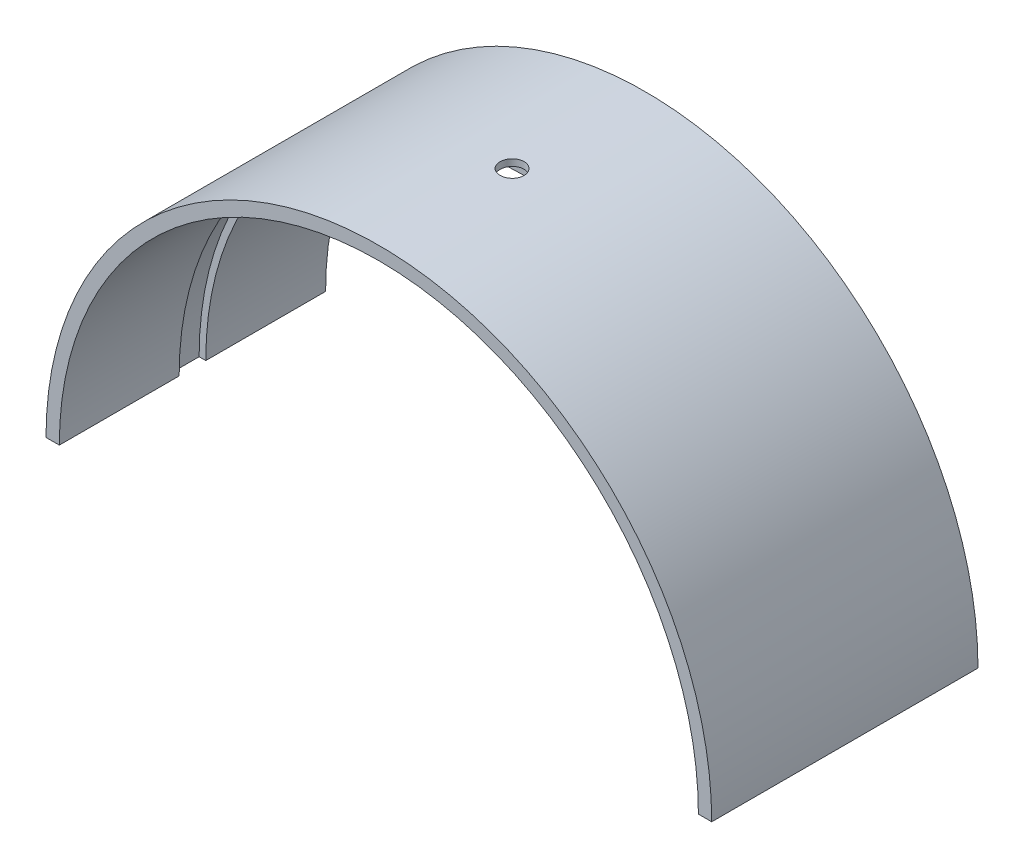
ISO-10303-21;
HEADER;
FILE_DESCRIPTION(('STEP AP214'),'2;1');
FILE_NAME('part.step','',(''),(''),'','','');
FILE_SCHEMA(('AUTOMOTIVE_DESIGN { 1 0 10303 214 1 1 1 1 }'));
ENDSEC;
DATA;
#1=APPLICATION_CONTEXT('core data for automotive mechanical design processes');
#2=APPLICATION_PROTOCOL_DEFINITION('international standard','automotive_design',2000,#1);
#3=PRODUCT_CONTEXT('',#1,'mechanical');
#4=PRODUCT('Part','Part','',(#3));
#5=PRODUCT_RELATED_PRODUCT_CATEGORY('part','',(#4));
#6=PRODUCT_DEFINITION_FORMATION('','',#4);
#7=PRODUCT_DEFINITION_CONTEXT('part definition',#1,'design');
#8=PRODUCT_DEFINITION('design','',#6,#7);
#9=PRODUCT_DEFINITION_SHAPE('','',#8);
#10=(LENGTH_UNIT() NAMED_UNIT(*) SI_UNIT(.MILLI.,.METRE.));
#11=(NAMED_UNIT(*) PLANE_ANGLE_UNIT() SI_UNIT($,.RADIAN.));
#12=(NAMED_UNIT(*) SI_UNIT($,.STERADIAN.) SOLID_ANGLE_UNIT());
#13=UNCERTAINTY_MEASURE_WITH_UNIT(LENGTH_MEASURE(1.E-05),#10,'distance_accuracy_value','');
#14=(GEOMETRIC_REPRESENTATION_CONTEXT(3) GLOBAL_UNCERTAINTY_ASSIGNED_CONTEXT((#13)) GLOBAL_UNIT_ASSIGNED_CONTEXT((#10,
#11,#12)) REPRESENTATION_CONTEXT('',''));
#15=CARTESIAN_POINT('',(0.,0.,0.));
#16=DIRECTION('',(0.,0.,1.));
#17=DIRECTION('',(1.,0.,0.));
#18=AXIS2_PLACEMENT_3D('',#15,#16,#17);
#19=CARTESIAN_POINT('',(0.,0.,20.));
#20=DIRECTION('',(0.,0.,-1.));
#21=DIRECTION('',(-1.,0.,0.));
#22=AXIS2_PLACEMENT_3D('',#19,#20,#21);
#23=CYLINDRICAL_SURFACE('',#22,24.);
#24=CARTESIAN_POINT('',(0.,0.,11.));
#25=DIRECTION('',(0.,0.,-1.));
#26=DIRECTION('',(-1.,0.,0.));
#27=AXIS2_PLACEMENT_3D('',#24,#25,#26);
#28=CIRCLE('',#27,24.);
#29=CARTESIAN_POINT('',(-24.,0.,11.));
#30=VERTEX_POINT('',#29);
#31=CARTESIAN_POINT('',(24.,0.,11.));
#32=VERTEX_POINT('',#31);
#33=EDGE_CURVE('E156',#30,#32,#28,.T.);
#34=ORIENTED_EDGE('',*,*,#33,.T.);
#35=DIRECTION('',(0.,0.,-1.));
#36=VECTOR('',#35,1.);
#37=CARTESIAN_POINT('',(24.,0.,20.));
#38=LINE('',#37,#36);
#39=CARTESIAN_POINT('',(24.,0.,20.));
#40=VERTEX_POINT('',#39);
#41=EDGE_CURVE('E118',#40,#32,#38,.T.);
#42=ORIENTED_EDGE('',*,*,#41,.F.);
#43=CARTESIAN_POINT('',(0.,0.,20.));
#44=DIRECTION('',(0.,0.,-1.));
#45=DIRECTION('',(1.,0.,0.));
#46=AXIS2_PLACEMENT_3D('',#43,#44,#45);
#47=CIRCLE('',#46,24.);
#48=CARTESIAN_POINT('',(-24.,0.,20.));
#49=VERTEX_POINT('',#48);
#50=EDGE_CURVE('E157',#49,#40,#47,.T.);
#51=ORIENTED_EDGE('',*,*,#50,.F.);
#52=DIRECTION('',(0.,0.,-1.));
#53=VECTOR('',#52,1.);
#54=CARTESIAN_POINT('',(-24.,0.,20.));
#55=LINE('',#54,#53);
#56=EDGE_CURVE('E131',#49,#30,#55,.T.);
#57=ORIENTED_EDGE('',*,*,#56,.T.);
#58=EDGE_LOOP('',(#34,#42,#51,#57));
#59=FACE_BOUND('',#58,.T.);
#60=ADVANCED_FACE('F34',(#59),#23,.F.);
#61=CARTESIAN_POINT('',(0.,0.,9.));
#62=DIRECTION('',(0.,0.,-1.));
#63=DIRECTION('',(-1.,0.,0.));
#64=AXIS2_PLACEMENT_3D('',#61,#62,#63);
#65=CIRCLE('',#64,24.);
#66=CARTESIAN_POINT('',(-24.,0.,9.));
#67=VERTEX_POINT('',#66);
#68=CARTESIAN_POINT('',(24.,0.,9.));
#69=VERTEX_POINT('',#68);
#70=EDGE_CURVE('E114',#67,#69,#65,.T.);
#71=ORIENTED_EDGE('',*,*,#70,.F.);
#72=CARTESIAN_POINT('',(-24.,0.,0.));
#73=VERTEX_POINT('',#72);
#74=EDGE_CURVE('E85',#67,#73,#55,.T.);
#75=ORIENTED_EDGE('',*,*,#74,.T.);
#76=CARTESIAN_POINT('',(0.,0.,0.));
#77=DIRECTION('',(0.,0.,-1.));
#78=DIRECTION('',(1.,0.,0.));
#79=AXIS2_PLACEMENT_3D('',#76,#77,#78);
#80=CIRCLE('',#79,24.);
#81=CARTESIAN_POINT('',(24.,0.,0.));
#82=VERTEX_POINT('',#81);
#83=EDGE_CURVE('E166',#73,#82,#80,.T.);
#84=ORIENTED_EDGE('',*,*,#83,.T.);
#85=EDGE_CURVE('E122',#69,#82,#38,.T.);
#86=ORIENTED_EDGE('',*,*,#85,.F.);
#87=EDGE_LOOP('',(#71,#75,#84,#86));
#88=FACE_BOUND('',#87,.T.);
#89=ADVANCED_FACE('F121',(#88),#23,.F.);
#90=CARTESIAN_POINT('',(25.,0.,20.));
#91=DIRECTION('',(0.,1.,0.));
#92=DIRECTION('',(0.,0.,1.));
#93=AXIS2_PLACEMENT_3D('',#90,#91,#92);
#94=PLANE('',#93);
#95=DIRECTION('',(-1.,0.,0.));
#96=VECTOR('',#95,1.);
#97=CARTESIAN_POINT('',(25.,0.,11.));
#98=LINE('',#97,#96);
#99=CARTESIAN_POINT('',(24.5,0.,11.));
#100=VERTEX_POINT('',#99);
#101=EDGE_CURVE('E162',#100,#32,#98,.T.);
#102=ORIENTED_EDGE('',*,*,#101,.F.);
#103=DIRECTION('',(0.,0.,-1.));
#104=VECTOR('',#103,1.);
#105=CARTESIAN_POINT('',(24.5,0.,0.));
#106=LINE('',#105,#104);
#107=CARTESIAN_POINT('',(24.5,0.,9.));
#108=VERTEX_POINT('',#107);
#109=EDGE_CURVE('E180',#108,#100,#106,.F.);
#110=ORIENTED_EDGE('',*,*,#109,.F.);
#111=DIRECTION('',(1.,0.,0.));
#112=VECTOR('',#111,1.);
#113=CARTESIAN_POINT('',(25.,0.,9.));
#114=LINE('',#113,#112);
#115=EDGE_CURVE('E179',#69,#108,#114,.T.);
#116=ORIENTED_EDGE('',*,*,#115,.F.);
#117=ORIENTED_EDGE('',*,*,#85,.T.);
#118=DIRECTION('',(1.,0.,0.));
#119=VECTOR('',#118,1.);
#120=CARTESIAN_POINT('',(25.,0.,0.));
#121=LINE('',#120,#119);
#122=CARTESIAN_POINT('',(25.,0.,0.));
#123=VERTEX_POINT('',#122);
#124=EDGE_CURVE('E168',#82,#123,#121,.T.);
#125=ORIENTED_EDGE('',*,*,#124,.T.);
#126=DIRECTION('',(0.,0.,-1.));
#127=VECTOR('',#126,1.);
#128=CARTESIAN_POINT('',(25.,0.,20.));
#129=LINE('',#128,#127);
#130=CARTESIAN_POINT('',(25.,0.,20.));
#131=VERTEX_POINT('',#130);
#132=EDGE_CURVE('E141',#131,#123,#129,.T.);
#133=ORIENTED_EDGE('',*,*,#132,.F.);
#134=DIRECTION('',(1.,0.,0.));
#135=VECTOR('',#134,1.);
#136=CARTESIAN_POINT('',(25.,0.,20.));
#137=LINE('',#136,#135);
#138=EDGE_CURVE('E93',#40,#131,#137,.T.);
#139=ORIENTED_EDGE('',*,*,#138,.F.);
#140=ORIENTED_EDGE('',*,*,#41,.T.);
#141=EDGE_LOOP('',(#102,#110,#116,#117,#125,#133,#139,#140));
#142=FACE_BOUND('',#141,.T.);
#143=ADVANCED_FACE('F178',(#142),#94,.F.);
#144=CARTESIAN_POINT('',(-24.,0.,20.));
#145=DIRECTION('',(0.,1.,0.));
#146=DIRECTION('',(0.,0.,1.));
#147=AXIS2_PLACEMENT_3D('',#144,#145,#146);
#148=PLANE('',#147);
#149=DIRECTION('',(-1.,0.,0.));
#150=VECTOR('',#149,1.);
#151=CARTESIAN_POINT('',(-24.,0.,11.));
#152=LINE('',#151,#150);
#153=CARTESIAN_POINT('',(-24.5,0.,11.));
#154=VERTEX_POINT('',#153);
#155=EDGE_CURVE('E11',#30,#154,#152,.T.);
#156=ORIENTED_EDGE('',*,*,#155,.F.);
#157=ORIENTED_EDGE('',*,*,#56,.F.);
#158=DIRECTION('',(1.,0.,0.));
#159=VECTOR('',#158,1.);
#160=CARTESIAN_POINT('',(-24.,0.,20.));
#161=LINE('',#160,#159);
#162=CARTESIAN_POINT('',(-25.,0.,20.));
#163=VERTEX_POINT('',#162);
#164=EDGE_CURVE('E63',#163,#49,#161,.T.);
#165=ORIENTED_EDGE('',*,*,#164,.F.);
#166=DIRECTION('',(0.,0.,-1.));
#167=VECTOR('',#166,1.);
#168=CARTESIAN_POINT('',(-25.,0.,20.));
#169=LINE('',#168,#167);
#170=CARTESIAN_POINT('',(-25.,0.,0.));
#171=VERTEX_POINT('',#170);
#172=EDGE_CURVE('E134',#163,#171,#169,.T.);
#173=ORIENTED_EDGE('',*,*,#172,.T.);
#174=DIRECTION('',(1.,0.,0.));
#175=VECTOR('',#174,1.);
#176=CARTESIAN_POINT('',(-24.,0.,0.));
#177=LINE('',#176,#175);
#178=EDGE_CURVE('E129',#171,#73,#177,.T.);
#179=ORIENTED_EDGE('',*,*,#178,.T.);
#180=ORIENTED_EDGE('',*,*,#74,.F.);
#181=DIRECTION('',(1.,0.,0.));
#182=VECTOR('',#181,1.);
#183=CARTESIAN_POINT('',(-24.,0.,9.));
#184=LINE('',#183,#182);
#185=CARTESIAN_POINT('',(-24.5,0.,9.));
#186=VERTEX_POINT('',#185);
#187=EDGE_CURVE('E112',#186,#67,#184,.T.);
#188=ORIENTED_EDGE('',*,*,#187,.F.);
#189=DIRECTION('',(0.,0.,-1.));
#190=VECTOR('',#189,1.);
#191=CARTESIAN_POINT('',(-24.5,0.,0.));
#192=LINE('',#191,#190);
#193=EDGE_CURVE('E47',#154,#186,#192,.T.);
#194=ORIENTED_EDGE('',*,*,#193,.F.);
#195=EDGE_LOOP('',(#156,#157,#165,#173,#179,#180,#188,#194));
#196=FACE_BOUND('',#195,.T.);
#197=ADVANCED_FACE('F126',(#196),#148,.F.);
#198=CARTESIAN_POINT('',(0.,0.,20.));
#199=DIRECTION('',(0.,0.,-1.));
#200=DIRECTION('',(-1.,0.,0.));
#201=AXIS2_PLACEMENT_3D('',#198,#199,#200);
#202=CYLINDRICAL_SURFACE('',#201,25.);
#203=CARTESIAN_POINT('',(0.,25.,9.1));
#204=CARTESIAN_POINT('',(0.050535829957511,24.9999997821146,9.10000223564241));
#205=CARTESIAN_POINT('',(0.101107886204852,24.9998451246391,9.10427073954814));
#206=CARTESIAN_POINT('',(0.200858013351447,24.9992430331769,9.12123874042541));
#207=CARTESIAN_POINT('',(0.250034351978574,24.998795250655,9.13394827432343));
#208=CARTESIAN_POINT('',(0.345533557905941,24.9976576121728,9.16743497476834));
#209=CARTESIAN_POINT('',(0.391857822470569,24.996967875876,9.18820815381038));
#210=CARTESIAN_POINT('',(0.480348825067872,24.9954241009306,9.23722664781565));
#211=CARTESIAN_POINT('',(0.522516566319997,24.9945701020761,9.26547015364747));
#212=CARTESIAN_POINT('',(0.601535420471143,24.992793372449,9.3286468030275));
#213=CARTESIAN_POINT('',(0.638383816447171,24.9918706069153,9.36358334407803));
#214=CARTESIAN_POINT('',(0.705695009782055,24.9900606494127,9.43914805243734));
#215=CARTESIAN_POINT('',(0.736157551232679,24.9891734588706,9.47977644773403));
#216=CARTESIAN_POINT('',(0.789837938182272,24.9875344936121,9.5655834282216));
#217=CARTESIAN_POINT('',(0.813053945584977,24.9867827532734,9.61076316403034));
#218=CARTESIAN_POINT('',(0.851570367321573,24.9854998231692,9.70438218213384));
#219=CARTESIAN_POINT('',(0.866870820397095,24.9849686323244,9.75282144847396));
#220=CARTESIAN_POINT('',(0.889115403017304,24.9841869777321,9.85156209121391));
#221=CARTESIAN_POINT('',(0.896063182768703,24.9839363913608,9.90186264429819));
#222=CARTESIAN_POINT('',(0.901416448483106,24.9837438327537,10.0029166896937));
#223=CARTESIAN_POINT('',(0.899821976784824,24.9838018589883,10.0536701797587));
#224=CARTESIAN_POINT('',(0.888139067220623,24.9842198679703,10.1541646240054));
#225=CARTESIAN_POINT('',(0.878054572670543,24.9845797105345,10.2039060372782));
#226=CARTESIAN_POINT('',(0.8496839828355,24.9855605683102,10.300989480446));
#227=CARTESIAN_POINT('',(0.831397865374746,24.9861815842279,10.348331503853));
#228=CARTESIAN_POINT('',(0.787138584095716,24.9876149471606,10.4392850030083));
#229=CARTESIAN_POINT('',(0.761163615103001,24.9884273390974,10.4828955995961));
#230=CARTESIAN_POINT('',(0.702265296005424,24.9901518306294,10.5651386661282));
#231=CARTESIAN_POINT('',(0.669341921810511,24.9910639305703,10.6037711188125));
#232=CARTESIAN_POINT('',(0.597459074243739,24.9928856456015,10.6749842280802));
#233=CARTESIAN_POINT('',(0.558496183141841,24.9937952589862,10.7075614349345));
#234=CARTESIAN_POINT('',(0.475652359994273,24.9955089649375,10.7657127387105));
#235=CARTESIAN_POINT('',(0.431771427065669,24.9963130574852,10.791286834375));
#236=CARTESIAN_POINT('',(0.340335197237806,24.9977251006857,10.8347055889489));
#237=CARTESIAN_POINT('',(0.292779847365181,24.9983330485101,10.8525501363983));
#238=CARTESIAN_POINT('',(0.195345578500073,24.9992842304056,10.880001037052));
#239=CARTESIAN_POINT('',(0.145466668571771,24.9996274655093,10.8896074223905));
#240=CARTESIAN_POINT('',(0.0448311307414584,25.0000104006701,10.9003050750168));
#241=CARTESIAN_POINT('',(-0.00592498917054655,25.0000502708673,10.9014011152814));
#242=CARTESIAN_POINT('',(-0.106900491218681,24.9998224330806,10.8950594077958));
#243=CARTESIAN_POINT('',(-0.15711987426157,24.9995547256163,10.8876216744647));
#244=CARTESIAN_POINT('',(-0.25558303287527,24.9987420084713,10.8644275002465));
#245=CARTESIAN_POINT('',(-0.303827320309746,24.998197071135,10.8486732295592));
#246=CARTESIAN_POINT('',(-0.396986537117233,24.9968912870011,10.8092953881289));
#247=CARTESIAN_POINT('',(-0.441901456694551,24.9961304395681,10.7856717942339));
#248=CARTESIAN_POINT('',(-0.527148923451362,24.9944780920711,10.731213620439));
#249=CARTESIAN_POINT('',(-0.567479419373229,24.9935865339271,10.7003758313391));
#250=CARTESIAN_POINT('',(-0.642392596182118,24.9917734198405,10.6323693453455));
#251=CARTESIAN_POINT('',(-0.67697525691377,24.9908518637927,10.5952006262528));
#252=CARTESIAN_POINT('',(-0.739427060525725,24.9890821545523,10.5155668902303));
#253=CARTESIAN_POINT('',(-0.767293121780838,24.9882340351669,10.4730994557205));
#254=CARTESIAN_POINT('',(-0.815499648963938,24.9867073559729,10.3840860813006));
#255=CARTESIAN_POINT('',(-0.835840135779761,24.9860287956937,10.337540152711));
#256=CARTESIAN_POINT('',(-0.868412726007746,24.9849179852326,10.2417026143968));
#257=CARTESIAN_POINT('',(-0.88064681593324,24.9844856747097,10.1924116805616));
#258=CARTESIAN_POINT('',(-0.896665838801739,24.9839159380231,10.0924737829479));
#259=CARTESIAN_POINT('',(-0.900450789183601,24.9837785112507,10.0418268219685));
#260=CARTESIAN_POINT('',(-0.899463868530838,24.9838140585843,9.94064532152565));
#261=CARTESIAN_POINT('',(-0.89469685239615,24.9839868565775,9.89011073457339));
#262=CARTESIAN_POINT('',(-0.876751318545876,24.9846230038243,9.79055969011896));
#263=CARTESIAN_POINT('',(-0.863572784289526,24.9850863536493,9.74154323560232));
#264=CARTESIAN_POINT('',(-0.829179113282818,24.9862513412054,9.64641835607139));
#265=CARTESIAN_POINT('',(-0.807963855236856,24.9869529825331,9.60030997495994));
#266=CARTESIAN_POINT('',(-0.758100236851855,24.9885154321198,9.51231002781494));
#267=CARTESIAN_POINT('',(-0.729452135203476,24.9893762348391,9.47041831509603));
#268=CARTESIAN_POINT('',(-0.665520265833703,24.9911604969519,9.39201762033073));
#269=CARTESIAN_POINT('',(-0.630233447226497,24.992083985028,9.35551112692981));
#270=CARTESIAN_POINT('',(-0.554021581378667,24.9938894477835,9.28892993773176));
#271=CARTESIAN_POINT('',(-0.513095142469351,24.994771412144,9.2588568341688));
#272=CARTESIAN_POINT('',(-0.426745822875753,24.9963947970882,9.20598878830162));
#273=CARTESIAN_POINT('',(-0.381319707298788,24.9971361154264,9.18319913267028));
#274=CARTESIAN_POINT('',(-0.287318176228993,24.9983929187085,9.14559669340345));
#275=CARTESIAN_POINT('',(-0.238746584932447,24.9989086721837,9.13077441988837));
#276=CARTESIAN_POINT('',(-0.158224503224093,24.9995187407918,9.11344562439819));
#277=CARTESIAN_POINT('',(-0.12679640493848,24.999698427448,9.10840988248285));
#278=CARTESIAN_POINT('',(-0.0635836521312207,24.9999391255774,9.1016863676272));
#279=CARTESIAN_POINT('',(-0.0317989977624168,25.0000001371015,9.0999985932518));
#280=CARTESIAN_POINT('',(0.,25.,9.1));
#281=B_SPLINE_CURVE_WITH_KNOTS('',3,(#203,#204,#205,#206,#207,#208,#209,#210,#211,#212,#213,
#214,#215,#216,#217,#218,#219,#220,#221,#222,#223,#224,#225,#226,#227,#228,#229,#230,#231,#232,
#233,#234,#235,#236,#237,#238,#239,#240,#241,#242,#243,#244,#245,#246,#247,#248,#249,#250,#251,
#252,#253,#254,#255,#256,#257,#258,#259,#260,#261,#262,#263,#264,#265,#266,#267,#268,#269,#270,
#271,#272,#273,#274,#275,#276,#277,#278,#279,#280),.UNSPECIFIED.,.T.,.F.,(4,2,2,2,2,2,2,2,2,2,2,
2,2,2,2,2,2,2,2,2,2,2,2,2,2,2,2,2,2,2,2,2,2,2,2,2,2,2,4),(0.,0.151491417505848,
0.303163291306592,0.454760258108646,0.606320545375004,0.757957972141803,0.90960147450119,
1.06128341030584,1.21296460371633,1.36457948671512,1.51619361825238,1.66773736920404,
1.81928152990669,1.97086129812668,2.12244159188085,2.27410797939034,2.42577439412844,
2.57744299582035,2.72911100590436,2.8806939477326,3.03227663343709,3.18381978318972,
3.33536337879607,3.48697451646394,3.63858618576051,3.79026728375719,3.94194796074764,
4.09359145386488,4.24523463399265,4.39679175443925,4.54834917291511,4.69990887888794,
4.85146331072557,5.00308756173752,5.15474929574461,5.30652086434365,5.45811125630726,
5.55343525346421,5.64875920976104),.UNSPECIFIED.);
#282=CARTESIAN_POINT('',(0.,25.,9.1));
#283=VERTEX_POINT('',#282);
#284=EDGE_CURVE('E123',#283,#283,#281,.T.);
#285=ORIENTED_EDGE('',*,*,#284,.T.);
#286=EDGE_LOOP('',(#285));
#287=FACE_BOUND('',#286,.T.);
#288=CARTESIAN_POINT('',(0.,0.,0.));
#289=DIRECTION('',(0.,0.,1.));
#290=DIRECTION('',(1.,0.,0.));
#291=AXIS2_PLACEMENT_3D('',#288,#289,#290);
#292=CIRCLE('',#291,25.);
#293=EDGE_CURVE('E160',#123,#171,#292,.T.);
#294=ORIENTED_EDGE('',*,*,#293,.T.);
#295=ORIENTED_EDGE('',*,*,#172,.F.);
#296=CARTESIAN_POINT('',(0.,0.,20.));
#297=DIRECTION('',(0.,0.,1.));
#298=DIRECTION('',(1.,0.,0.));
#299=AXIS2_PLACEMENT_3D('',#296,#297,#298);
#300=CIRCLE('',#299,25.);
#301=EDGE_CURVE('E135',#131,#163,#300,.T.);
#302=ORIENTED_EDGE('',*,*,#301,.F.);
#303=ORIENTED_EDGE('',*,*,#132,.T.);
#304=EDGE_LOOP('',(#294,#295,#302,#303));
#305=FACE_BOUND('',#304,.T.);
#306=ADVANCED_FACE('F172',(#287,#305),#202,.T.);
#307=CARTESIAN_POINT('',(0.,0.,20.));
#308=DIRECTION('',(0.,0.,1.));
#309=DIRECTION('',(1.,0.,0.));
#310=AXIS2_PLACEMENT_3D('',#307,#308,#309);
#311=PLANE('',#310);
#312=ORIENTED_EDGE('',*,*,#50,.T.);
#313=ORIENTED_EDGE('',*,*,#138,.T.);
#314=ORIENTED_EDGE('',*,*,#301,.T.);
#315=ORIENTED_EDGE('',*,*,#164,.T.);
#316=EDGE_LOOP('',(#312,#313,#314,#315));
#317=FACE_BOUND('',#316,.T.);
#318=ADVANCED_FACE('F207',(#317),#311,.T.);
#319=CARTESIAN_POINT('',(0.,0.,0.));
#320=DIRECTION('',(0.,0.,1.));
#321=DIRECTION('',(1.,0.,0.));
#322=AXIS2_PLACEMENT_3D('',#319,#320,#321);
#323=PLANE('',#322);
#324=ORIENTED_EDGE('',*,*,#83,.F.);
#325=ORIENTED_EDGE('',*,*,#178,.F.);
#326=ORIENTED_EDGE('',*,*,#293,.F.);
#327=ORIENTED_EDGE('',*,*,#124,.F.);
#328=EDGE_LOOP('',(#324,#325,#326,#327));
#329=FACE_BOUND('',#328,.T.);
#330=ADVANCED_FACE('F176',(#329),#323,.F.);
#331=CARTESIAN_POINT('',(-24.,0.,11.));
#332=DIRECTION('',(0.,0.,-1.));
#333=DIRECTION('',(-1.,0.,0.));
#334=AXIS2_PLACEMENT_3D('',#331,#332,#333);
#335=PLANE('',#334);
#336=ORIENTED_EDGE('',*,*,#101,.T.);
#337=ORIENTED_EDGE('',*,*,#33,.F.);
#338=ORIENTED_EDGE('',*,*,#155,.T.);
#339=CARTESIAN_POINT('',(0.,0.,11.));
#340=DIRECTION('',(0.,0.,-1.));
#341=DIRECTION('',(-1.,0.,0.));
#342=AXIS2_PLACEMENT_3D('',#339,#340,#341);
#343=CIRCLE('',#342,24.5);
#344=EDGE_CURVE('E150',#154,#100,#343,.T.);
#345=ORIENTED_EDGE('',*,*,#344,.T.);
#346=EDGE_LOOP('',(#336,#337,#338,#345));
#347=FACE_BOUND('',#346,.T.);
#348=ADVANCED_FACE('F203',(#347),#335,.T.);
#349=CARTESIAN_POINT('',(0.,0.,0.));
#350=DIRECTION('',(0.,0.,-1.));
#351=DIRECTION('',(-1.,0.,0.));
#352=AXIS2_PLACEMENT_3D('',#349,#350,#351);
#353=CYLINDRICAL_SURFACE('',#352,24.5);
#354=CARTESIAN_POINT('',(0.,24.5,9.1));
#355=CARTESIAN_POINT('',(0.0505351060782391,24.4999997777193,9.10000223538102));
#356=CARTESIAN_POINT('',(0.101106420724203,24.4998419685368,9.10427061748716));
#357=CARTESIAN_POINT('',(0.200855035460117,24.499227607288,9.1212381063636));
#358=CARTESIAN_POINT('',(0.250030604068245,24.4987706997461,9.13394724515907));
#359=CARTESIAN_POINT('',(0.345528266124883,24.4976098771127,9.16743283446827));
#360=CARTESIAN_POINT('',(0.391851758754188,24.4969060842924,9.18820529212123));
#361=CARTESIAN_POINT('',(0.480341370296564,24.4953308430445,9.23722202121835));
#362=CARTESIAN_POINT('',(0.522508491280468,24.4944594351779,9.26546448562059));
#363=CARTESIAN_POINT('',(0.601527041724291,24.4926464614145,9.32863931582851));
#364=CARTESIAN_POINT('',(0.638375665502354,24.491704858882,9.36357519017532));
#365=CARTESIAN_POINT('',(0.705687480975213,24.4898579404172,9.43913860415428));
#366=CARTESIAN_POINT('',(0.736150416552575,24.4889526259416,9.47976637196812));
#367=CARTESIAN_POINT('',(0.789832073100561,24.4872801553044,9.56557272413134));
#368=CARTESIAN_POINT('',(0.81304887440522,24.4865130357765,9.6107525102277));
#369=CARTESIAN_POINT('',(0.851566823368687,24.4852038483768,9.70437189616067));
#370=CARTESIAN_POINT('',(0.866868010713494,24.4846617793767,9.75281147965248));
#371=CARTESIAN_POINT('',(0.889113712393846,24.4838641141697,9.85155208541579));
#372=CARTESIAN_POINT('',(0.896062027972267,24.4836083876569,9.90185225021922));
#373=CARTESIAN_POINT('',(0.901416467016089,24.4834118511139,10.0029056369599));
#374=CARTESIAN_POINT('',(0.899822633931691,24.4834710394818,10.0536588565914));
#375=CARTESIAN_POINT('',(0.888141209918508,24.4838975368855,10.1541518593652));
#376=CARTESIAN_POINT('',(0.878057725236362,24.4842646969622,10.203892120542));
#377=CARTESIAN_POINT('',(0.849689587459661,24.4852655154777,10.3009734293539));
#378=CARTESIAN_POINT('',(0.83140491163499,24.4858991746551,10.348314470339));
#379=CARTESIAN_POINT('',(0.787148718762686,24.4873617351961,10.4392667290833));
#380=CARTESIAN_POINT('',(0.761175322276081,24.4881906842865,10.4828770315334));
#381=CARTESIAN_POINT('',(0.702280362135567,24.4899503325209,10.5651198481201));
#382=CARTESIAN_POINT('',(0.669358773284215,24.490881032034,10.603752344204));
#383=CARTESIAN_POINT('',(0.597478740517277,24.4927399316147,10.6749668253185));
#384=CARTESIAN_POINT('',(0.558516737859196,24.4936681298786,10.707545218503));
#385=CARTESIAN_POINT('',(0.475674405472432,24.4954168654581,10.7656990514857));
#386=CARTESIAN_POINT('',(0.43179407484838,24.4962374027542,10.7912744900091));
#387=CARTESIAN_POINT('',(0.340358662170344,24.4976783434958,10.8346960357738));
#388=CARTESIAN_POINT('',(0.292803524755661,24.4982987439255,10.8525420265448));
#389=CARTESIAN_POINT('',(0.195369323657861,24.4992694331828,10.8799957854731));
#390=CARTESIAN_POINT('',(0.145490269410039,24.4996197231071,10.889603587075));
#391=CARTESIAN_POINT('',(0.044855323030833,24.5000105668965,10.9003038284925));
#392=CARTESIAN_POINT('',(-0.00590004003000974,24.5000513015234,10.9014012378723));
#393=CARTESIAN_POINT('',(-0.106874255094776,24.4998189223698,10.8950624991286));
#394=CARTESIAN_POINT('',(-0.157093108043517,24.499545809142,10.8876263660356));
#395=CARTESIAN_POINT('',(-0.25555489779959,24.4987166255881,10.8644357400135));
#396=CARTESIAN_POINT('',(-0.303798367607939,24.4981606321401,10.8486835070987));
#397=CARTESIAN_POINT('',(-0.396956315781611,24.4968283246329,10.8093101218721));
#398=CARTESIAN_POINT('',(-0.441870783933727,24.496052009898,10.78568894542));
#399=CARTESIAN_POINT('',(-0.527118630317461,24.4943660278986,10.7312354151267));
#400=CARTESIAN_POINT('',(-0.567449873222022,24.4934562989249,10.7003997203359));
#401=CARTESIAN_POINT('',(-0.642364960123001,24.4916062004816,10.6323973643767));
#402=CARTESIAN_POINT('',(-0.676948783226594,24.4906658309007,10.5952306801951));
#403=CARTESIAN_POINT('',(-0.739403957700736,24.4888599417767,10.5156000512098));
#404=CARTESIAN_POINT('',(-0.767272100258647,24.4879944581409,10.4731335887755));
#405=CARTESIAN_POINT('',(-0.815482908665855,24.4864364888819,10.384121671765));
#406=CARTESIAN_POINT('',(-0.835825595932535,24.4857440027664,10.337576228798));
#407=CARTESIAN_POINT('',(-0.868402421095068,24.4846103645958,10.2417396316347));
#408=CARTESIAN_POINT('',(-0.880638626446128,24.4841691484615,10.1924491809968));
#409=CARTESIAN_POINT('',(-0.896661918695542,24.4835876183772,10.0925118202634));
#410=CARTESIAN_POINT('',(-0.900449024383912,24.483447303758,10.0418649131849));
#411=CARTESIAN_POINT('',(-0.899466382713746,24.4834834202253,9.94068435131579));
#412=CARTESIAN_POINT('',(-0.894701690063422,24.4836596642037,9.8901506472898));
#413=CARTESIAN_POINT('',(-0.876761119269286,24.4843086367024,9.79060099304162));
#414=CARTESIAN_POINT('',(-0.863585224604651,24.484781365805,9.74158504580073));
#415=CARTESIAN_POINT('',(-0.829197121319195,24.4859699856831,9.64646076528486));
#416=CARTESIAN_POINT('',(-0.807984793438202,24.486685880067,9.60035247517118));
#417=CARTESIAN_POINT('',(-0.758127255735359,24.4882801031161,9.51235216845745));
#418=CARTESIAN_POINT('',(-0.729482303233341,24.4891584261576,9.47046000596339));
#419=CARTESIAN_POINT('',(-0.665556073380794,24.4909790575738,9.39205683877686));
#420=CARTESIAN_POINT('',(-0.63027159084608,24.4919213967107,9.35554844830705));
#421=CARTESIAN_POINT('',(-0.554064051327021,24.4937637478822,9.28896304689808));
#422=CARTESIAN_POINT('',(-0.513139602892659,24.4946637493979,9.2588876277407));
#423=CARTESIAN_POINT('',(-0.426793327767193,24.4963203812061,9.20601430082854));
#424=CARTESIAN_POINT('',(-0.381368219856142,24.4970769057078,9.18322175458831));
#425=CARTESIAN_POINT('',(-0.287368054038593,24.498359532988,9.14561344019055));
#426=CARTESIAN_POINT('',(-0.238796819865821,24.4988859096665,9.13078818527765));
#427=CARTESIAN_POINT('',(-0.158266803914835,24.4995086559252,9.1134528680171));
#428=CARTESIAN_POINT('',(-0.126830430064506,24.4996921076025,9.10841441626923));
#429=CARTESIAN_POINT('',(-0.0636008188793684,24.4999378495663,9.10168727951747));
#430=CARTESIAN_POINT('',(-0.031807581704065,24.5000001399069,9.09999859301642));
#431=CARTESIAN_POINT('',(0.,24.5,9.1));
#432=B_SPLINE_CURVE_WITH_KNOTS('',3,(#354,#355,#356,#357,#358,#359,#360,#361,#362,#363,#364,
#365,#366,#367,#368,#369,#370,#371,#372,#373,#374,#375,#376,#377,#378,#379,#380,#381,#382,#383,
#384,#385,#386,#387,#388,#389,#390,#391,#392,#393,#394,#395,#396,#397,#398,#399,#400,#401,#402,
#403,#404,#405,#406,#407,#408,#409,#410,#411,#412,#413,#414,#415,#416,#417,#418,#419,#420,#421,
#422,#423,#424,#425,#426,#427,#428,#429,#430,#431),.UNSPECIFIED.,.T.,.F.,(4,2,2,2,2,2,2,2,2,2,2,
2,2,2,2,2,2,2,2,2,2,2,2,2,2,2,2,2,2,2,2,2,2,2,2,2,2,2,4),(0.,0.151489214279058,
0.303158799800879,0.454753375939524,0.606311313877181,0.757948913650054,0.909592594146602,
1.06127641447353,1.21295947430577,1.36457347972142,1.51618671394318,1.66772665847641,
1.81926702301472,1.97084446087038,2.12242244842719,2.27409008074402,2.42575774067162,
2.57742768590722,2.72909701540396,2.88067777233702,3.03225826228573,3.18379757934336,
3.33533736129664,3.48694745873901,3.6385581072972,3.79024105378945,3.94192356858998,
4.09356738378506,4.24521086173799,4.39676473735314,4.54831891064307,4.69987533307567,
4.85142650927658,5.00305103425648,5.15471303409084,5.30648642877394,5.45807870226744,
5.55342841236032,5.64877807983713),.UNSPECIFIED.);
#433=CARTESIAN_POINT('',(0.,24.5,9.1));
#434=VERTEX_POINT('',#433);
#435=EDGE_CURVE('E37',#434,#434,#432,.T.);
#436=ORIENTED_EDGE('',*,*,#435,.F.);
#437=EDGE_LOOP('',(#436));
#438=FACE_BOUND('',#437,.T.);
#439=ORIENTED_EDGE('',*,*,#109,.T.);
#440=ORIENTED_EDGE('',*,*,#344,.F.);
#441=ORIENTED_EDGE('',*,*,#193,.T.);
#442=CARTESIAN_POINT('',(0.,0.,9.));
#443=DIRECTION('',(0.,0.,-1.));
#444=DIRECTION('',(-1.,0.,0.));
#445=AXIS2_PLACEMENT_3D('',#442,#443,#444);
#446=CIRCLE('',#445,24.5);
#447=EDGE_CURVE('E54',#186,#108,#446,.T.);
#448=ORIENTED_EDGE('',*,*,#447,.T.);
#449=EDGE_LOOP('',(#439,#440,#441,#448));
#450=FACE_BOUND('',#449,.T.);
#451=ADVANCED_FACE('F147',(#438,#450),#353,.F.);
#452=CARTESIAN_POINT('',(-24.,0.,9.));
#453=DIRECTION('',(0.,0.,1.));
#454=DIRECTION('',(1.,0.,0.));
#455=AXIS2_PLACEMENT_3D('',#452,#453,#454);
#456=PLANE('',#455);
#457=ORIENTED_EDGE('',*,*,#115,.T.);
#458=ORIENTED_EDGE('',*,*,#447,.F.);
#459=ORIENTED_EDGE('',*,*,#187,.T.);
#460=ORIENTED_EDGE('',*,*,#70,.T.);
#461=EDGE_LOOP('',(#457,#458,#459,#460));
#462=FACE_BOUND('',#461,.T.);
#463=ADVANCED_FACE('F113',(#462),#456,.T.);
#464=CARTESIAN_POINT('',(0.,25.,10.));
#465=DIRECTION('',(0.,-1.,0.));
#466=DIRECTION('',(0.,0.,-1.));
#467=AXIS2_PLACEMENT_3D('',#464,#465,#466);
#468=CYLINDRICAL_SURFACE('',#467,0.9);
#469=ORIENTED_EDGE('',*,*,#435,.T.);
#470=EDGE_LOOP('',(#469));
#471=FACE_BOUND('',#470,.T.);
#472=ORIENTED_EDGE('',*,*,#284,.F.);
#473=EDGE_LOOP('',(#472));
#474=FACE_BOUND('',#473,.T.);
#475=ADVANCED_FACE('F193',(#471,#474),#468,.F.);
#476=CLOSED_SHELL('',(#60,#89,#143,#197,#306,#318,#330,#348,#451,#463,#475));
#477=MANIFOLD_SOLID_BREP('B2',#476);
#478=ADVANCED_BREP_SHAPE_REPRESENTATION('',(#18,#477),#14);
#479=SHAPE_DEFINITION_REPRESENTATION(#9,#478);
ENDSEC;
END-ISO-10303-21;
